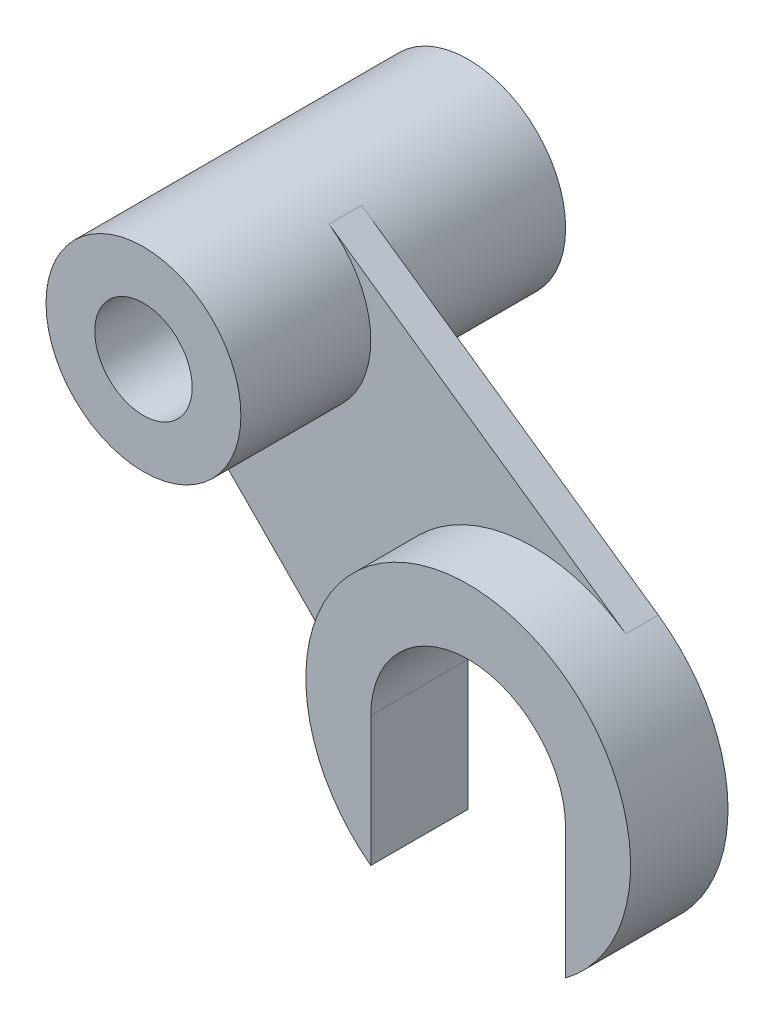
ISO-10303-21;
HEADER;
FILE_DESCRIPTION(('STEP AP214'),'2;1');
FILE_NAME('part.step','',(''),(''),'','','');
FILE_SCHEMA(('AUTOMOTIVE_DESIGN { 1 0 10303 214 1 1 1 1 }'));
ENDSEC;
DATA;
#1=APPLICATION_CONTEXT('core data for automotive mechanical design processes');
#2=APPLICATION_PROTOCOL_DEFINITION('international standard','automotive_design',2000,#1);
#3=PRODUCT_CONTEXT('',#1,'mechanical');
#4=PRODUCT('Part','Part','',(#3));
#5=PRODUCT_RELATED_PRODUCT_CATEGORY('part','',(#4));
#6=PRODUCT_DEFINITION_FORMATION('','',#4);
#7=PRODUCT_DEFINITION_CONTEXT('part definition',#1,'design');
#8=PRODUCT_DEFINITION('design','',#6,#7);
#9=PRODUCT_DEFINITION_SHAPE('','',#8);
#10=(LENGTH_UNIT() NAMED_UNIT(*) SI_UNIT(.MILLI.,.METRE.));
#11=(NAMED_UNIT(*) PLANE_ANGLE_UNIT() SI_UNIT($,.RADIAN.));
#12=(NAMED_UNIT(*) SI_UNIT($,.STERADIAN.) SOLID_ANGLE_UNIT());
#13=UNCERTAINTY_MEASURE_WITH_UNIT(LENGTH_MEASURE(1.E-05),#10,'distance_accuracy_value','');
#14=(GEOMETRIC_REPRESENTATION_CONTEXT(3) GLOBAL_UNCERTAINTY_ASSIGNED_CONTEXT((#13)) GLOBAL_UNIT_ASSIGNED_CONTEXT((#10,
#11,#12)) REPRESENTATION_CONTEXT('',''));
#15=CARTESIAN_POINT('',(0.,0.,0.));
#16=DIRECTION('',(0.,0.,1.));
#17=DIRECTION('',(1.,0.,0.));
#18=AXIS2_PLACEMENT_3D('',#15,#16,#17);
#19=CARTESIAN_POINT('',(30.,40.,100.));
#20=DIRECTION('',(0.,0.,-1.));
#21=DIRECTION('',(-1.,0.,0.));
#22=AXIS2_PLACEMENT_3D('',#19,#20,#21);
#23=CYLINDRICAL_SURFACE('',#22,15.);
#24=CARTESIAN_POINT('',(30.,40.,100.));
#25=DIRECTION('',(0.,0.,1.));
#26=DIRECTION('',(1.,0.,0.));
#27=AXIS2_PLACEMENT_3D('',#24,#25,#26);
#28=CIRCLE('',#27,15.);
#29=CARTESIAN_POINT('',(45.,40.,100.));
#30=VERTEX_POINT('',#29);
#31=EDGE_CURVE('E49',#30,#30,#28,.T.);
#32=ORIENTED_EDGE('',*,*,#31,.T.);
#33=EDGE_LOOP('',(#32));
#34=FACE_BOUND('',#33,.T.);
#35=CARTESIAN_POINT('',(30.,40.,0.));
#36=DIRECTION('',(0.,0.,1.));
#37=DIRECTION('',(1.,0.,0.));
#38=AXIS2_PLACEMENT_3D('',#35,#36,#37);
#39=CIRCLE('',#38,15.);
#40=CARTESIAN_POINT('',(45.,40.,0.));
#41=VERTEX_POINT('',#40);
#42=EDGE_CURVE('E188',#41,#41,#39,.T.);
#43=ORIENTED_EDGE('',*,*,#42,.F.);
#44=EDGE_LOOP('',(#43));
#45=FACE_BOUND('',#44,.T.);
#46=ADVANCED_FACE('F41',(#34,#45),#23,.F.);
#47=CARTESIAN_POINT('',(30.,40.,100.));
#48=DIRECTION('',(0.,0.,-1.));
#49=DIRECTION('',(-1.,0.,0.));
#50=AXIS2_PLACEMENT_3D('',#47,#48,#49);
#51=CYLINDRICAL_SURFACE('',#50,30.);
#52=DIRECTION('',(0.,0.,-1.));
#53=VECTOR('',#52,1.);
#54=CARTESIAN_POINT('',(0.,40.,60.));
#55=LINE('',#54,#53);
#56=CARTESIAN_POINT('',(0.,40.,60.));
#57=VERTEX_POINT('',#56);
#58=CARTESIAN_POINT('',(0.,40.,50.));
#59=VERTEX_POINT('',#58);
#60=EDGE_CURVE('E62',#57,#59,#55,.T.);
#61=ORIENTED_EDGE('',*,*,#60,.F.);
#62=CARTESIAN_POINT('',(30.,40.,60.));
#63=DIRECTION('',(0.,0.,1.));
#64=DIRECTION('',(1.,0.,0.));
#65=AXIS2_PLACEMENT_3D('',#62,#63,#64);
#66=CIRCLE('',#65,30.);
#67=CARTESIAN_POINT('',(47.1291163606126,64.6291163606126,60.));
#68=VERTEX_POINT('',#67);
#69=EDGE_CURVE('E57',#57,#68,#66,.T.);
#70=ORIENTED_EDGE('',*,*,#69,.T.);
#71=DIRECTION('',(0.,0.,-1.));
#72=VECTOR('',#71,1.);
#73=CARTESIAN_POINT('',(47.1291163606126,64.6291163606126,60.));
#74=LINE('',#73,#72);
#75=CARTESIAN_POINT('',(47.1291163606126,64.6291163606126,50.));
#76=VERTEX_POINT('',#75);
#77=EDGE_CURVE('E183',#68,#76,#74,.T.);
#78=ORIENTED_EDGE('',*,*,#77,.T.);
#79=CARTESIAN_POINT('',(30.,40.,50.));
#80=DIRECTION('',(0.,0.,1.));
#81=DIRECTION('',(1.,0.,0.));
#82=AXIS2_PLACEMENT_3D('',#79,#80,#81);
#83=CIRCLE('',#82,30.);
#84=EDGE_CURVE('E171',#59,#76,#83,.T.);
#85=ORIENTED_EDGE('',*,*,#84,.F.);
#86=EDGE_LOOP('',(#61,#70,#78,#85));
#87=FACE_BOUND('',#86,.T.);
#88=CARTESIAN_POINT('',(30.,40.,100.));
#89=DIRECTION('',(0.,0.,1.));
#90=DIRECTION('',(1.,0.,0.));
#91=AXIS2_PLACEMENT_3D('',#88,#89,#90);
#92=CIRCLE('',#91,30.);
#93=CARTESIAN_POINT('',(60.,40.,100.));
#94=VERTEX_POINT('',#93);
#95=EDGE_CURVE('E11',#94,#94,#92,.T.);
#96=ORIENTED_EDGE('',*,*,#95,.F.);
#97=EDGE_LOOP('',(#96));
#98=FACE_BOUND('',#97,.T.);
#99=CARTESIAN_POINT('',(30.,40.,0.));
#100=DIRECTION('',(0.,0.,1.));
#101=DIRECTION('',(1.,0.,0.));
#102=AXIS2_PLACEMENT_3D('',#99,#100,#101);
#103=CIRCLE('',#102,30.);
#104=CARTESIAN_POINT('',(60.,40.,0.));
#105=VERTEX_POINT('',#104);
#106=EDGE_CURVE('E44',#105,#105,#103,.T.);
#107=ORIENTED_EDGE('',*,*,#106,.T.);
#108=EDGE_LOOP('',(#107));
#109=FACE_BOUND('',#108,.T.);
#110=ADVANCED_FACE('F196',(#87,#98,#109),#51,.T.);
#111=CARTESIAN_POINT('',(0.,0.,100.));
#112=DIRECTION('',(0.,0.,1.));
#113=DIRECTION('',(1.,0.,0.));
#114=AXIS2_PLACEMENT_3D('',#111,#112,#113);
#115=PLANE('',#114);
#116=ORIENTED_EDGE('',*,*,#31,.F.);
#117=EDGE_LOOP('',(#116));
#118=FACE_BOUND('',#117,.T.);
#119=ORIENTED_EDGE('',*,*,#95,.T.);
#120=EDGE_LOOP('',(#119));
#121=FACE_BOUND('',#120,.T.);
#122=ADVANCED_FACE('F201',(#118,#121),#115,.T.);
#123=CARTESIAN_POINT('',(0.,0.,0.));
#124=DIRECTION('',(0.,0.,1.));
#125=DIRECTION('',(1.,0.,0.));
#126=AXIS2_PLACEMENT_3D('',#123,#124,#125);
#127=PLANE('',#126);
#128=ORIENTED_EDGE('',*,*,#42,.T.);
#129=EDGE_LOOP('',(#128));
#130=FACE_BOUND('',#129,.T.);
#131=ORIENTED_EDGE('',*,*,#106,.F.);
#132=EDGE_LOOP('',(#131));
#133=FACE_BOUND('',#132,.T.);
#134=ADVANCED_FACE('F198',(#130,#133),#127,.F.);
#135=CARTESIAN_POINT('',(45.6593372704594,65.6513218141501,60.));
#136=DIRECTION('',(0.570970545353752,0.820970545353753,0.));
#137=DIRECTION('',(-0.820970545353753,0.570970545353752,0.));
#138=AXIS2_PLACEMENT_3D('',#135,#136,#137);
#139=PLANE('',#138);
#140=DIRECTION('',(0.820970545353753,-0.570970545353752,0.));
#141=VECTOR('',#140,1.);
#142=CARTESIAN_POINT('',(45.6593372704594,65.6513218141501,50.));
#143=LINE('',#142,#141);
#144=CARTESIAN_POINT('',(138.548527267688,1.04852726768764,50.));
#145=VERTEX_POINT('',#144);
#146=EDGE_CURVE('E134',#76,#145,#143,.T.);
#147=ORIENTED_EDGE('',*,*,#146,.F.);
#148=ORIENTED_EDGE('',*,*,#77,.F.);
#149=DIRECTION('',(0.820970545353753,-0.570970545353752,0.));
#150=VECTOR('',#149,1.);
#151=CARTESIAN_POINT('',(45.6593372704594,65.6513218141501,60.));
#152=LINE('',#151,#150);
#153=CARTESIAN_POINT('',(138.548527267688,1.04852726768764,60.));
#154=VERTEX_POINT('',#153);
#155=EDGE_CURVE('E158',#68,#154,#152,.T.);
#156=ORIENTED_EDGE('',*,*,#155,.T.);
#157=DIRECTION('',(0.,0.,-1.));
#158=VECTOR('',#157,1.);
#159=CARTESIAN_POINT('',(138.548527267688,1.04852726768766,60.));
#160=LINE('',#159,#158);
#161=EDGE_CURVE('E185',#154,#145,#160,.T.);
#162=ORIENTED_EDGE('',*,*,#161,.T.);
#163=EDGE_LOOP('',(#147,#148,#156,#162));
#164=FACE_BOUND('',#163,.T.);
#165=ADVANCED_FACE('F200',(#164),#139,.T.);
#166=CARTESIAN_POINT('',(0.,0.,60.));
#167=DIRECTION('',(1.,0.,0.));
#168=DIRECTION('',(0.,1.,0.));
#169=AXIS2_PLACEMENT_3D('',#166,#167,#168);
#170=PLANE('',#169);
#171=DIRECTION('',(0.,-1.,0.));
#172=VECTOR('',#171,1.);
#173=CARTESIAN_POINT('',(0.,0.,50.));
#174=LINE('',#173,#172);
#175=CARTESIAN_POINT('',(0.,0.,50.));
#176=VERTEX_POINT('',#175);
#177=EDGE_CURVE('E174',#59,#176,#174,.T.);
#178=ORIENTED_EDGE('',*,*,#177,.T.);
#179=DIRECTION('',(0.,0.,-1.));
#180=VECTOR('',#179,1.);
#181=CARTESIAN_POINT('',(0.,0.,60.));
#182=LINE('',#181,#180);
#183=CARTESIAN_POINT('',(0.,0.,60.));
#184=VERTEX_POINT('',#183);
#185=EDGE_CURVE('E179',#184,#176,#182,.T.);
#186=ORIENTED_EDGE('',*,*,#185,.F.);
#187=DIRECTION('',(0.,-1.,0.));
#188=VECTOR('',#187,1.);
#189=CARTESIAN_POINT('',(0.,0.,60.));
#190=LINE('',#189,#188);
#191=EDGE_CURVE('E163',#57,#184,#190,.T.);
#192=ORIENTED_EDGE('',*,*,#191,.F.);
#193=ORIENTED_EDGE('',*,*,#60,.T.);
#194=EDGE_LOOP('',(#178,#186,#192,#193));
#195=FACE_BOUND('',#194,.T.);
#196=ADVANCED_FACE('F208',(#195),#170,.F.);
#197=CARTESIAN_POINT('',(0.,0.,60.));
#198=DIRECTION('',(0.710452707861558,0.703744946619285,0.));
#199=DIRECTION('',(-0.703744946619285,0.710452707861558,0.));
#200=AXIS2_PLACEMENT_3D('',#197,#198,#199);
#201=PLANE('',#200);
#202=DIRECTION('',(0.703744946619285,-0.710452707861558,0.));
#203=VECTOR('',#202,1.);
#204=CARTESIAN_POINT('',(0.,0.,50.));
#205=LINE('',#204,#203);
#206=CARTESIAN_POINT('',(74.4773646069222,-75.1872473309642,50.));
#207=VERTEX_POINT('',#206);
#208=EDGE_CURVE('E159',#176,#207,#205,.T.);
#209=ORIENTED_EDGE('',*,*,#208,.T.);
#210=DIRECTION('',(0.,0.,-1.));
#211=VECTOR('',#210,1.);
#212=CARTESIAN_POINT('',(74.4773646069222,-75.1872473309642,60.));
#213=LINE('',#212,#211);
#214=CARTESIAN_POINT('',(74.4773646069221,-75.1872473309642,60.));
#215=VERTEX_POINT('',#214);
#216=EDGE_CURVE('E168',#215,#207,#213,.T.);
#217=ORIENTED_EDGE('',*,*,#216,.F.);
#218=DIRECTION('',(0.703744946619285,-0.710452707861558,0.));
#219=VECTOR('',#218,1.);
#220=CARTESIAN_POINT('',(0.,0.,60.));
#221=LINE('',#220,#219);
#222=EDGE_CURVE('E165',#184,#215,#221,.T.);
#223=ORIENTED_EDGE('',*,*,#222,.F.);
#224=ORIENTED_EDGE('',*,*,#185,.T.);
#225=EDGE_LOOP('',(#209,#217,#223,#224));
#226=FACE_BOUND('',#225,.T.);
#227=ADVANCED_FACE('F231',(#226),#201,.F.);
#228=CARTESIAN_POINT('',(0.,0.,60.));
#229=DIRECTION('',(0.,0.,1.));
#230=DIRECTION('',(1.,0.,0.));
#231=AXIS2_PLACEMENT_3D('',#228,#229,#230);
#232=PLANE('',#231);
#233=CARTESIAN_POINT('',(110.,-40.,60.));
#234=DIRECTION('',(0.,0.,1.));
#235=DIRECTION('',(1.,0.,0.));
#236=AXIS2_PLACEMENT_3D('',#233,#234,#235);
#237=CIRCLE('',#236,50.);
#238=EDGE_CURVE('E156',#154,#215,#237,.T.);
#239=ORIENTED_EDGE('',*,*,#238,.F.);
#240=ORIENTED_EDGE('',*,*,#155,.F.);
#241=ORIENTED_EDGE('',*,*,#69,.F.);
#242=ORIENTED_EDGE('',*,*,#191,.T.);
#243=ORIENTED_EDGE('',*,*,#222,.T.);
#244=EDGE_LOOP('',(#239,#240,#241,#242,#243));
#245=FACE_BOUND('',#244,.T.);
#246=ADVANCED_FACE('F246',(#245),#232,.T.);
#247=CARTESIAN_POINT('',(0.,0.,50.));
#248=DIRECTION('',(0.,0.,1.));
#249=DIRECTION('',(1.,0.,0.));
#250=AXIS2_PLACEMENT_3D('',#247,#248,#249);
#251=PLANE('',#250);
#252=ORIENTED_EDGE('',*,*,#146,.T.);
#253=CARTESIAN_POINT('',(110.,-40.,50.));
#254=DIRECTION('',(0.,0.,1.));
#255=DIRECTION('',(1.,0.,0.));
#256=AXIS2_PLACEMENT_3D('',#253,#254,#255);
#257=CIRCLE('',#256,50.);
#258=CARTESIAN_POINT('',(140.,-80.,50.));
#259=VERTEX_POINT('',#258);
#260=EDGE_CURVE('E144',#259,#145,#257,.T.);
#261=ORIENTED_EDGE('',*,*,#260,.F.);
#262=DIRECTION('',(0.,-1.,0.));
#263=VECTOR('',#262,1.);
#264=CARTESIAN_POINT('',(140.,0.,50.));
#265=LINE('',#264,#263);
#266=CARTESIAN_POINT('',(140.,-40.,50.));
#267=VERTEX_POINT('',#266);
#268=EDGE_CURVE('E124',#267,#259,#265,.T.);
#269=ORIENTED_EDGE('',*,*,#268,.F.);
#270=CARTESIAN_POINT('',(110.,-40.,50.));
#271=DIRECTION('',(0.,0.,1.));
#272=DIRECTION('',(1.,0.,0.));
#273=AXIS2_PLACEMENT_3D('',#270,#271,#272);
#274=CIRCLE('',#273,30.);
#275=CARTESIAN_POINT('',(80.,-40.,50.));
#276=VERTEX_POINT('',#275);
#277=EDGE_CURVE('E148',#267,#276,#274,.T.);
#278=ORIENTED_EDGE('',*,*,#277,.T.);
#279=DIRECTION('',(0.,-1.,0.));
#280=VECTOR('',#279,1.);
#281=CARTESIAN_POINT('',(80.,0.,50.));
#282=LINE('',#281,#280);
#283=CARTESIAN_POINT('',(80.,-80.,50.));
#284=VERTEX_POINT('',#283);
#285=EDGE_CURVE('E146',#276,#284,#282,.T.);
#286=ORIENTED_EDGE('',*,*,#285,.T.);
#287=EDGE_CURVE('E130',#207,#284,#257,.T.);
#288=ORIENTED_EDGE('',*,*,#287,.F.);
#289=ORIENTED_EDGE('',*,*,#208,.F.);
#290=ORIENTED_EDGE('',*,*,#177,.F.);
#291=ORIENTED_EDGE('',*,*,#84,.T.);
#292=EDGE_LOOP('',(#252,#261,#269,#278,#286,#288,#289,#290,#291));
#293=FACE_BOUND('',#292,.T.);
#294=ADVANCED_FACE('F255',(#293),#251,.F.);
#295=CARTESIAN_POINT('',(110.,-40.,80.));
#296=DIRECTION('',(0.,0.,-1.));
#297=DIRECTION('',(-1.,0.,0.));
#298=AXIS2_PLACEMENT_3D('',#295,#296,#297);
#299=CYLINDRICAL_SURFACE('',#298,50.);
#300=ORIENTED_EDGE('',*,*,#260,.T.);
#301=ORIENTED_EDGE('',*,*,#161,.F.);
#302=ORIENTED_EDGE('',*,*,#238,.T.);
#303=ORIENTED_EDGE('',*,*,#216,.T.);
#304=ORIENTED_EDGE('',*,*,#287,.T.);
#305=DIRECTION('',(0.,0.,-1.));
#306=VECTOR('',#305,1.);
#307=CARTESIAN_POINT('',(80.,-80.,80.));
#308=LINE('',#307,#306);
#309=CARTESIAN_POINT('',(80.,-80.,80.));
#310=VERTEX_POINT('',#309);
#311=EDGE_CURVE('E127',#310,#284,#308,.T.);
#312=ORIENTED_EDGE('',*,*,#311,.F.);
#313=CARTESIAN_POINT('',(110.,-40.,80.));
#314=DIRECTION('',(0.,0.,1.));
#315=DIRECTION('',(1.,0.,0.));
#316=AXIS2_PLACEMENT_3D('',#313,#314,#315);
#317=CIRCLE('',#316,50.);
#318=CARTESIAN_POINT('',(140.,-80.,80.));
#319=VERTEX_POINT('',#318);
#320=EDGE_CURVE('E112',#319,#310,#317,.T.);
#321=ORIENTED_EDGE('',*,*,#320,.F.);
#322=DIRECTION('',(0.,0.,-1.));
#323=VECTOR('',#322,1.);
#324=CARTESIAN_POINT('',(140.,-80.,80.));
#325=LINE('',#324,#323);
#326=EDGE_CURVE('E143',#319,#259,#325,.T.);
#327=ORIENTED_EDGE('',*,*,#326,.T.);
#328=EDGE_LOOP('',(#300,#301,#302,#303,#304,#312,#321,#327));
#329=FACE_BOUND('',#328,.T.);
#330=ADVANCED_FACE('F128',(#329),#299,.T.);
#331=CARTESIAN_POINT('',(80.,0.,80.));
#332=DIRECTION('',(1.,0.,0.));
#333=DIRECTION('',(0.,1.,0.));
#334=AXIS2_PLACEMENT_3D('',#331,#332,#333);
#335=PLANE('',#334);
#336=ORIENTED_EDGE('',*,*,#285,.F.);
#337=DIRECTION('',(0.,0.,-1.));
#338=VECTOR('',#337,1.);
#339=CARTESIAN_POINT('',(80.,-40.,80.));
#340=LINE('',#339,#338);
#341=CARTESIAN_POINT('',(80.,-40.,80.));
#342=VERTEX_POINT('',#341);
#343=EDGE_CURVE('E135',#342,#276,#340,.T.);
#344=ORIENTED_EDGE('',*,*,#343,.F.);
#345=DIRECTION('',(0.,-1.,0.));
#346=VECTOR('',#345,1.);
#347=CARTESIAN_POINT('',(80.,0.,80.));
#348=LINE('',#347,#346);
#349=EDGE_CURVE('E117',#342,#310,#348,.T.);
#350=ORIENTED_EDGE('',*,*,#349,.T.);
#351=ORIENTED_EDGE('',*,*,#311,.T.);
#352=EDGE_LOOP('',(#336,#344,#350,#351));
#353=FACE_BOUND('',#352,.T.);
#354=ADVANCED_FACE('F137',(#353),#335,.T.);
#355=CARTESIAN_POINT('',(110.,-40.,80.));
#356=DIRECTION('',(0.,0.,-1.));
#357=DIRECTION('',(-1.,0.,0.));
#358=AXIS2_PLACEMENT_3D('',#355,#356,#357);
#359=CYLINDRICAL_SURFACE('',#358,30.);
#360=ORIENTED_EDGE('',*,*,#277,.F.);
#361=DIRECTION('',(0.,0.,-1.));
#362=VECTOR('',#361,1.);
#363=CARTESIAN_POINT('',(140.,-40.,80.));
#364=LINE('',#363,#362);
#365=CARTESIAN_POINT('',(140.,-40.,80.));
#366=VERTEX_POINT('',#365);
#367=EDGE_CURVE('E153',#366,#267,#364,.T.);
#368=ORIENTED_EDGE('',*,*,#367,.F.);
#369=CARTESIAN_POINT('',(110.,-40.,80.));
#370=DIRECTION('',(0.,0.,1.));
#371=DIRECTION('',(1.,0.,0.));
#372=AXIS2_PLACEMENT_3D('',#369,#370,#371);
#373=CIRCLE('',#372,30.);
#374=EDGE_CURVE('E138',#366,#342,#373,.T.);
#375=ORIENTED_EDGE('',*,*,#374,.T.);
#376=ORIENTED_EDGE('',*,*,#343,.T.);
#377=EDGE_LOOP('',(#360,#368,#375,#376));
#378=FACE_BOUND('',#377,.T.);
#379=ADVANCED_FACE('F279',(#378),#359,.F.);
#380=CARTESIAN_POINT('',(140.,0.,80.));
#381=DIRECTION('',(1.,0.,0.));
#382=DIRECTION('',(0.,0.,-1.));
#383=AXIS2_PLACEMENT_3D('',#380,#381,#382);
#384=PLANE('',#383);
#385=ORIENTED_EDGE('',*,*,#268,.T.);
#386=ORIENTED_EDGE('',*,*,#326,.F.);
#387=DIRECTION('',(0.,-1.,0.));
#388=VECTOR('',#387,1.);
#389=CARTESIAN_POINT('',(140.,0.,80.));
#390=LINE('',#389,#388);
#391=EDGE_CURVE('E120',#366,#319,#390,.T.);
#392=ORIENTED_EDGE('',*,*,#391,.F.);
#393=ORIENTED_EDGE('',*,*,#367,.T.);
#394=EDGE_LOOP('',(#385,#386,#392,#393));
#395=FACE_BOUND('',#394,.T.);
#396=ADVANCED_FACE('F287',(#395),#384,.F.);
#397=CARTESIAN_POINT('',(0.,0.,80.));
#398=DIRECTION('',(0.,0.,1.));
#399=DIRECTION('',(1.,0.,0.));
#400=AXIS2_PLACEMENT_3D('',#397,#398,#399);
#401=PLANE('',#400);
#402=ORIENTED_EDGE('',*,*,#320,.T.);
#403=ORIENTED_EDGE('',*,*,#349,.F.);
#404=ORIENTED_EDGE('',*,*,#374,.F.);
#405=ORIENTED_EDGE('',*,*,#391,.T.);
#406=EDGE_LOOP('',(#402,#403,#404,#405));
#407=FACE_BOUND('',#406,.T.);
#408=ADVANCED_FACE('F114',(#407),#401,.T.);
#409=CLOSED_SHELL('',(#46,#110,#122,#134,#165,#196,#227,#246,#294,#330,#354,#379,#396,#408));
#410=MANIFOLD_SOLID_BREP('B2',#409);
#411=ADVANCED_BREP_SHAPE_REPRESENTATION('',(#18,#410),#14);
#412=SHAPE_DEFINITION_REPRESENTATION(#9,#411);
ENDSEC;
END-ISO-10303-21;
